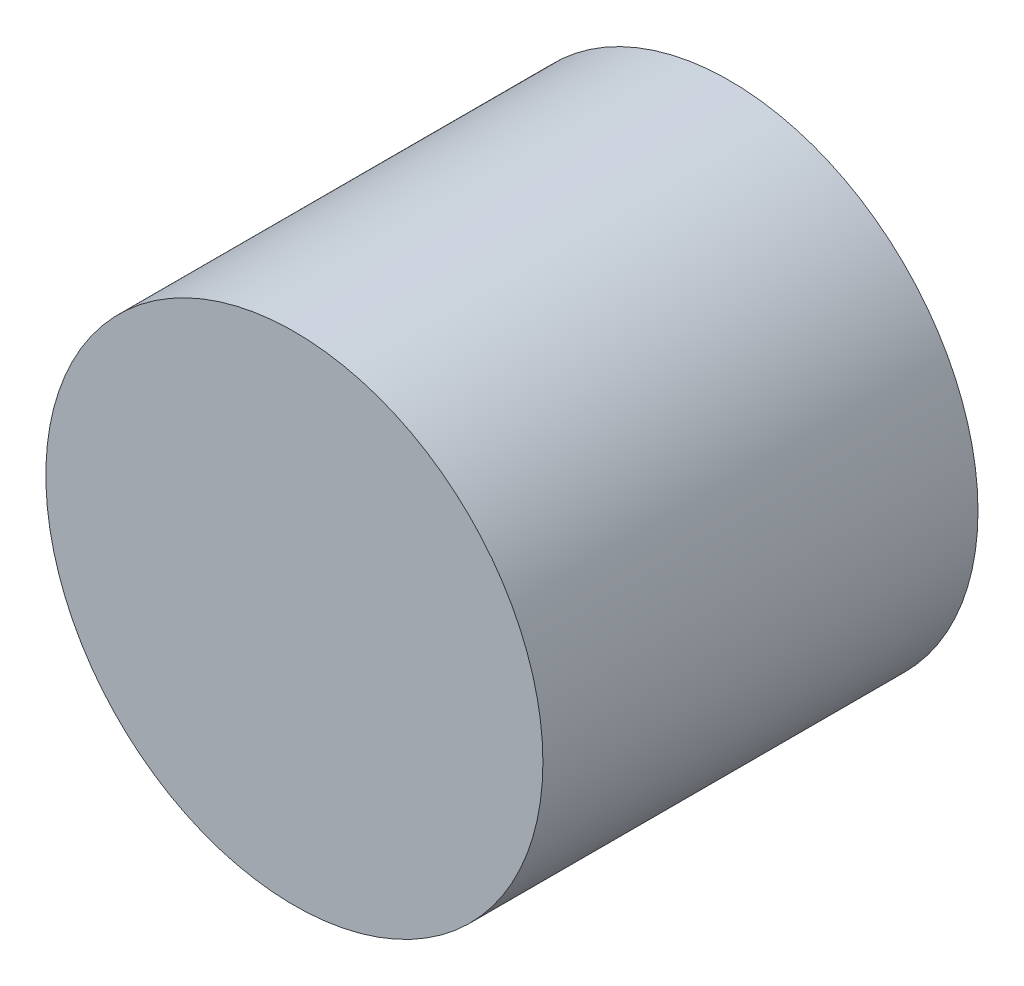
ISO-10303-21;
HEADER;
FILE_DESCRIPTION(('STEP AP214'),'2;1');
FILE_NAME('part.step','',(''),(''),'','','');
FILE_SCHEMA(('AUTOMOTIVE_DESIGN { 1 0 10303 214 1 1 1 1 }'));
ENDSEC;
DATA;
#1=APPLICATION_CONTEXT('core data for automotive mechanical design processes');
#2=APPLICATION_PROTOCOL_DEFINITION('international standard','automotive_design',2000,#1);
#3=PRODUCT_CONTEXT('',#1,'mechanical');
#4=PRODUCT('Part','Part','',(#3));
#5=PRODUCT_RELATED_PRODUCT_CATEGORY('part','',(#4));
#6=PRODUCT_DEFINITION_FORMATION('','',#4);
#7=PRODUCT_DEFINITION_CONTEXT('part definition',#1,'design');
#8=PRODUCT_DEFINITION('design','',#6,#7);
#9=PRODUCT_DEFINITION_SHAPE('','',#8);
#10=(LENGTH_UNIT() NAMED_UNIT(*) SI_UNIT(.MILLI.,.METRE.));
#11=(NAMED_UNIT(*) PLANE_ANGLE_UNIT() SI_UNIT($,.RADIAN.));
#12=(NAMED_UNIT(*) SI_UNIT($,.STERADIAN.) SOLID_ANGLE_UNIT());
#13=UNCERTAINTY_MEASURE_WITH_UNIT(LENGTH_MEASURE(1.E-05),#10,'distance_accuracy_value','');
#14=(GEOMETRIC_REPRESENTATION_CONTEXT(3) GLOBAL_UNCERTAINTY_ASSIGNED_CONTEXT((#13)) GLOBAL_UNIT_ASSIGNED_CONTEXT((#10,
#11,#12)) REPRESENTATION_CONTEXT('',''));
#15=CARTESIAN_POINT('',(0.,0.,0.));
#16=DIRECTION('',(0.,0.,1.));
#17=DIRECTION('',(1.,0.,0.));
#18=AXIS2_PLACEMENT_3D('',#15,#16,#17);
#19=CARTESIAN_POINT('',(0.,0.,13.97));
#20=DIRECTION('',(0.,0.,-1.));
#21=DIRECTION('',(-1.,0.,0.));
#22=AXIS2_PLACEMENT_3D('',#19,#20,#21);
#23=CYLINDRICAL_SURFACE('',#22,7.98);
#24=CARTESIAN_POINT('',(0.,0.,13.97));
#25=DIRECTION('',(0.,0.,1.));
#26=DIRECTION('',(1.,0.,0.));
#27=AXIS2_PLACEMENT_3D('',#24,#25,#26);
#28=CIRCLE('',#27,7.98);
#29=CARTESIAN_POINT('',(7.98,0.,13.97));
#30=VERTEX_POINT('',#29);
#31=EDGE_CURVE('E10',#30,#30,#28,.T.);
#32=ORIENTED_EDGE('',*,*,#31,.F.);
#33=EDGE_LOOP('',(#32));
#34=FACE_BOUND('',#33,.T.);
#35=CARTESIAN_POINT('',(0.,0.,0.));
#36=DIRECTION('',(0.,0.,1.));
#37=DIRECTION('',(1.,0.,0.));
#38=AXIS2_PLACEMENT_3D('',#35,#36,#37);
#39=CIRCLE('',#38,7.98);
#40=CARTESIAN_POINT('',(7.98,0.,0.));
#41=VERTEX_POINT('',#40);
#42=EDGE_CURVE('E41',#41,#41,#39,.T.);
#43=ORIENTED_EDGE('',*,*,#42,.T.);
#44=EDGE_LOOP('',(#43));
#45=FACE_BOUND('',#44,.T.);
#46=ADVANCED_FACE('F38',(#34,#45),#23,.T.);
#47=CARTESIAN_POINT('',(0.,0.,13.97));
#48=DIRECTION('',(0.,0.,1.));
#49=DIRECTION('',(1.,0.,0.));
#50=AXIS2_PLACEMENT_3D('',#47,#48,#49);
#51=PLANE('',#50);
#52=ORIENTED_EDGE('',*,*,#31,.T.);
#53=EDGE_LOOP('',(#52));
#54=FACE_BOUND('',#53,.T.);
#55=ADVANCED_FACE('F53',(#54),#51,.T.);
#56=CARTESIAN_POINT('',(0.,0.,0.));
#57=DIRECTION('',(0.,0.,1.));
#58=DIRECTION('',(1.,0.,0.));
#59=AXIS2_PLACEMENT_3D('',#56,#57,#58);
#60=PLANE('',#59);
#61=ORIENTED_EDGE('',*,*,#42,.F.);
#62=EDGE_LOOP('',(#61));
#63=FACE_BOUND('',#62,.T.);
#64=ADVANCED_FACE('F51',(#63),#60,.F.);
#65=CLOSED_SHELL('',(#46,#55,#64));
#66=MANIFOLD_SOLID_BREP('B2',#65);
#67=ADVANCED_BREP_SHAPE_REPRESENTATION('',(#18,#66),#14);
#68=SHAPE_DEFINITION_REPRESENTATION(#9,#67);
ENDSEC;
END-ISO-10303-21;
